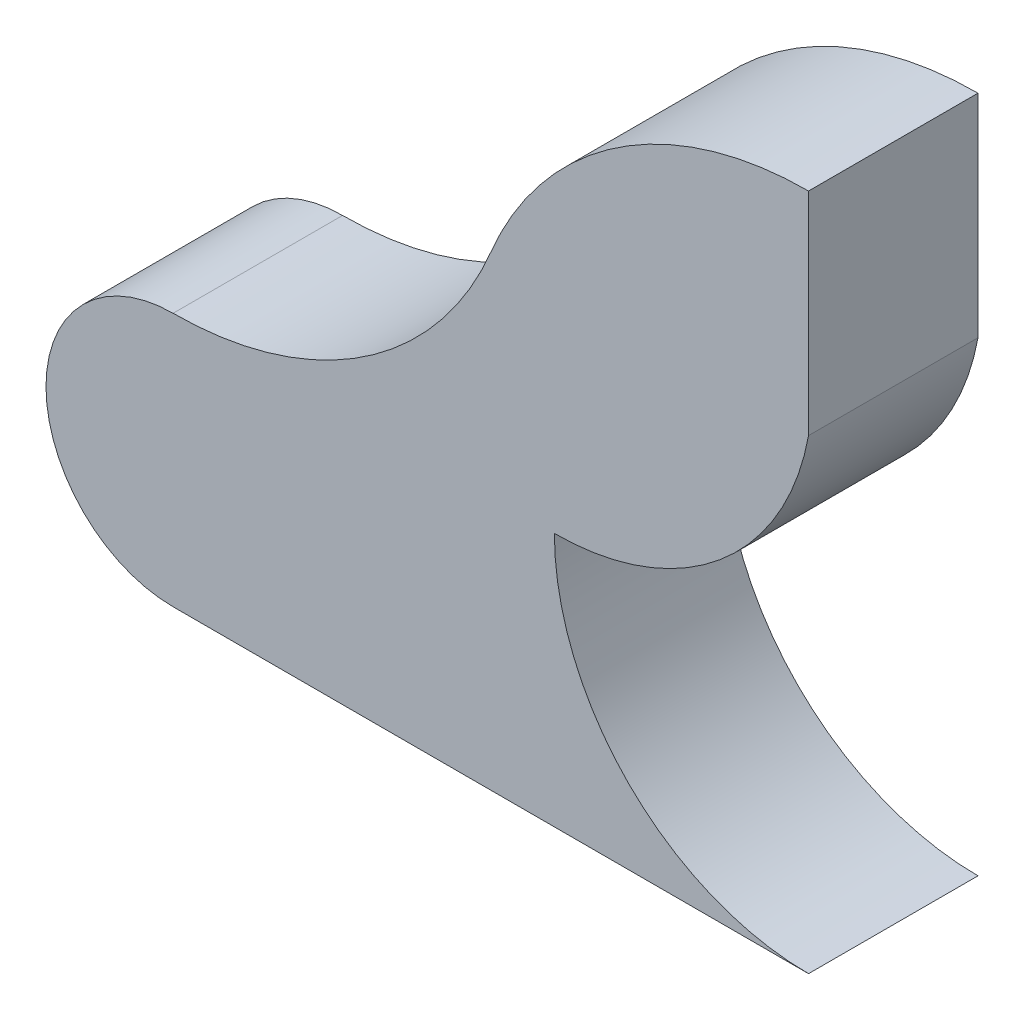
ISO-10303-21;
HEADER;
FILE_DESCRIPTION(('STEP AP214'),'2;1');
FILE_NAME('part.step','',(''),(''),'','','');
FILE_SCHEMA(('AUTOMOTIVE_DESIGN { 1 0 10303 214 1 1 1 1 }'));
ENDSEC;
DATA;
#1=APPLICATION_CONTEXT('core data for automotive mechanical design processes');
#2=APPLICATION_PROTOCOL_DEFINITION('international standard','automotive_design',2000,#1);
#3=PRODUCT_CONTEXT('',#1,'mechanical');
#4=PRODUCT('Part','Part','',(#3));
#5=PRODUCT_RELATED_PRODUCT_CATEGORY('part','',(#4));
#6=PRODUCT_DEFINITION_FORMATION('','',#4);
#7=PRODUCT_DEFINITION_CONTEXT('part definition',#1,'design');
#8=PRODUCT_DEFINITION('design','',#6,#7);
#9=PRODUCT_DEFINITION_SHAPE('','',#8);
#10=(LENGTH_UNIT() NAMED_UNIT(*) SI_UNIT(.MILLI.,.METRE.));
#11=(NAMED_UNIT(*) PLANE_ANGLE_UNIT() SI_UNIT($,.RADIAN.));
#12=(NAMED_UNIT(*) SI_UNIT($,.STERADIAN.) SOLID_ANGLE_UNIT());
#13=UNCERTAINTY_MEASURE_WITH_UNIT(LENGTH_MEASURE(1.E-05),#10,'distance_accuracy_value','');
#14=(GEOMETRIC_REPRESENTATION_CONTEXT(3) GLOBAL_UNCERTAINTY_ASSIGNED_CONTEXT((#13)) GLOBAL_UNIT_ASSIGNED_CONTEXT((#10,
#11,#12)) REPRESENTATION_CONTEXT('',''));
#15=CARTESIAN_POINT('',(0.,0.,0.));
#16=DIRECTION('',(0.,0.,1.));
#17=DIRECTION('',(1.,0.,0.));
#18=AXIS2_PLACEMENT_3D('',#15,#16,#17);
#19=CARTESIAN_POINT('',(-11.25,0.,-10.));
#20=DIRECTION('',(0.,0.,1.));
#21=DIRECTION('',(1.,0.,0.));
#22=AXIS2_PLACEMENT_3D('',#19,#20,#21);
#23=PLANE('',#22);
#24=DIRECTION('',(1.,0.,0.));
#25=VECTOR('',#24,1.);
#26=CARTESIAN_POINT('',(11.25,-7.5,-10.));
#27=LINE('',#26,#25);
#28=CARTESIAN_POINT('',(-11.25,-7.50000000000002,-10.));
#29=VERTEX_POINT('',#28);
#30=CARTESIAN_POINT('',(26.25,-7.5,-10.));
#31=VERTEX_POINT('',#30);
#32=EDGE_CURVE('E308',#29,#31,#27,.T.);
#33=ORIENTED_EDGE('',*,*,#32,.F.);
#34=CARTESIAN_POINT('',(-11.25,0.,-10.));
#35=DIRECTION('',(0.,0.,1.));
#36=DIRECTION('',(1.,0.,0.));
#37=AXIS2_PLACEMENT_3D('',#34,#35,#36);
#38=CIRCLE('',#37,7.50000000000001);
#39=CARTESIAN_POINT('',(-11.25,7.5,-10.));
#40=VERTEX_POINT('',#39);
#41=EDGE_CURVE('E305',#40,#29,#38,.T.);
#42=ORIENTED_EDGE('',*,*,#41,.F.);
#43=CARTESIAN_POINT('',(-11.25,27.8125,-10.));
#44=DIRECTION('',(0.,0.,1.));
#45=DIRECTION('',(1.,0.,0.));
#46=AXIS2_PLACEMENT_3D('',#43,#44,#45);
#47=CIRCLE('',#46,20.3125);
#48=CARTESIAN_POINT('',(7.5,20.,-10.));
#49=VERTEX_POINT('',#48);
#50=EDGE_CURVE('E230',#40,#49,#47,.T.);
#51=ORIENTED_EDGE('',*,*,#50,.T.);
#52=CARTESIAN_POINT('',(26.25,12.1875000000001,-10.));
#53=DIRECTION('',(0.,0.,-1.));
#54=DIRECTION('',(-1.,0.,0.));
#55=AXIS2_PLACEMENT_3D('',#52,#53,#54);
#56=CIRCLE('',#55,20.3124999999999);
#57=CARTESIAN_POINT('',(26.25,32.5,-10.));
#58=VERTEX_POINT('',#57);
#59=EDGE_CURVE('E246',#49,#58,#56,.T.);
#60=ORIENTED_EDGE('',*,*,#59,.T.);
#61=DIRECTION('',(0.,-1.,0.));
#62=VECTOR('',#61,1.);
#63=CARTESIAN_POINT('',(26.25,20.,-10.));
#64=LINE('',#63,#62);
#65=CARTESIAN_POINT('',(26.25,20.,-10.));
#66=VERTEX_POINT('',#65);
#67=EDGE_CURVE('E249',#58,#66,#64,.T.);
#68=ORIENTED_EDGE('',*,*,#67,.T.);
#69=CARTESIAN_POINT('',(11.25,22.75,-10.));
#70=DIRECTION('',(0.,0.,-1.));
#71=DIRECTION('',(1.,0.,0.));
#72=AXIS2_PLACEMENT_3D('',#69,#70,#71);
#73=CIRCLE('',#72,15.25);
#74=CARTESIAN_POINT('',(11.25,7.5,-10.));
#75=VERTEX_POINT('',#74);
#76=EDGE_CURVE('E235',#66,#75,#73,.T.);
#77=ORIENTED_EDGE('',*,*,#76,.T.);
#78=CARTESIAN_POINT('',(26.25,7.5,-10.));
#79=DIRECTION('',(0.,0.,-1.));
#80=DIRECTION('',(1.,0.,0.));
#81=AXIS2_PLACEMENT_3D('',#78,#79,#80);
#82=CIRCLE('',#81,15.);
#83=EDGE_CURVE('E311',#31,#75,#82,.T.);
#84=ORIENTED_EDGE('',*,*,#83,.F.);
#85=EDGE_LOOP('',(#33,#42,#51,#60,#68,#77,#84));
#86=FACE_BOUND('',#85,.T.);
#87=CARTESIAN_POINT('',(-11.25,0.,-10.));
#88=DIRECTION('',(0.,0.,1.));
#89=DIRECTION('',(1.,0.,0.));
#90=AXIS2_PLACEMENT_3D('',#87,#88,#89);
#91=CIRCLE('',#90,6.50000000000001);
#92=CARTESIAN_POINT('',(-11.25,6.5,-10.));
#93=VERTEX_POINT('',#92);
#94=CARTESIAN_POINT('',(-11.25,-6.49999999999999,-10.));
#95=VERTEX_POINT('',#94);
#96=EDGE_CURVE('E288',#93,#95,#91,.T.);
#97=ORIENTED_EDGE('',*,*,#96,.T.);
#98=DIRECTION('',(0.,-1.,0.));
#99=VECTOR('',#98,1.);
#100=CARTESIAN_POINT('',(-11.25,-6.50000000000002,-10.));
#101=LINE('',#100,#99);
#102=CARTESIAN_POINT('',(-11.25,-5.50000000000002,-10.));
#103=VERTEX_POINT('',#102);
#104=EDGE_CURVE('E264',#103,#95,#101,.T.);
#105=ORIENTED_EDGE('',*,*,#104,.F.);
#106=DIRECTION('',(-1.,0.,0.));
#107=VECTOR('',#106,1.);
#108=CARTESIAN_POINT('',(13.2596189432334,-5.50000000000002,-10.));
#109=LINE('',#108,#107);
#110=CARTESIAN_POINT('',(13.2596189432334,-5.50000000000002,-10.));
#111=VERTEX_POINT('',#110);
#112=EDGE_CURVE('E261',#111,#103,#109,.T.);
#113=ORIENTED_EDGE('',*,*,#112,.F.);
#114=DIRECTION('',(0.,1.,0.));
#115=VECTOR('',#114,1.);
#116=CARTESIAN_POINT('',(13.2596189432334,-7.50000000000001,-10.));
#117=LINE('',#116,#115);
#118=CARTESIAN_POINT('',(13.2596189432334,-6.49999999999999,-10.));
#119=VERTEX_POINT('',#118);
#120=EDGE_CURVE('E256',#119,#111,#117,.T.);
#121=ORIENTED_EDGE('',*,*,#120,.F.);
#122=DIRECTION('',(1.,0.,0.));
#123=VECTOR('',#122,1.);
#124=CARTESIAN_POINT('',(-11.25,-6.49999999999999,-10.));
#125=LINE('',#124,#123);
#126=CARTESIAN_POINT('',(18.5040333075852,-6.5,-10.));
#127=VERTEX_POINT('',#126);
#128=EDGE_CURVE('E298',#119,#127,#125,.T.);
#129=ORIENTED_EDGE('',*,*,#128,.T.);
#130=CARTESIAN_POINT('',(26.25,7.5,-10.));
#131=DIRECTION('',(0.,0.,1.));
#132=DIRECTION('',(1.,0.,0.));
#133=AXIS2_PLACEMENT_3D('',#130,#131,#132);
#134=CIRCLE('',#133,16.);
#135=CARTESIAN_POINT('',(10.2812805773287,6.5,-10.));
#136=VERTEX_POINT('',#135);
#137=EDGE_CURVE('E301',#127,#136,#134,.F.);
#138=ORIENTED_EDGE('',*,*,#137,.T.);
#139=DIRECTION('',(-1.,0.,0.));
#140=VECTOR('',#139,1.);
#141=CARTESIAN_POINT('',(-11.25,6.5,-10.));
#142=LINE('',#141,#140);
#143=EDGE_CURVE('E284',#136,#93,#142,.T.);
#144=ORIENTED_EDGE('',*,*,#143,.T.);
#145=EDGE_LOOP('',(#97,#105,#113,#121,#129,#138,#144));
#146=FACE_BOUND('',#145,.T.);
#147=DIRECTION('',(-1.,0.,0.));
#148=VECTOR('',#147,1.);
#149=CARTESIAN_POINT('',(-11.25,7.5,-10.));
#150=LINE('',#149,#148);
#151=CARTESIAN_POINT('',(10.25,7.5,-10.));
#152=VERTEX_POINT('',#151);
#153=CARTESIAN_POINT('',(-4.79825604971803,7.5,-10.));
#154=VERTEX_POINT('',#153);
#155=EDGE_CURVE('E186',#152,#154,#150,.T.);
#156=ORIENTED_EDGE('',*,*,#155,.F.);
#157=CARTESIAN_POINT('',(26.25,7.5,-10.));
#158=DIRECTION('',(0.,0.,1.));
#159=DIRECTION('',(1.,0.,0.));
#160=AXIS2_PLACEMENT_3D('',#157,#158,#159);
#161=CIRCLE('',#160,16.);
#162=CARTESIAN_POINT('',(10.283369893137,8.53282284570857,-10.));
#163=VERTEX_POINT('',#162);
#164=EDGE_CURVE('E185',#152,#163,#161,.F.);
#165=ORIENTED_EDGE('',*,*,#164,.T.);
#166=CARTESIAN_POINT('',(11.25,22.75,-10.));
#167=DIRECTION('',(0.,0.,1.));
#168=DIRECTION('',(1.,0.,0.));
#169=AXIS2_PLACEMENT_3D('',#166,#167,#168);
#170=CIRCLE('',#169,14.25);
#171=CARTESIAN_POINT('',(25.25,20.0924635468163,-10.));
#172=VERTEX_POINT('',#171);
#173=EDGE_CURVE('E200',#172,#163,#170,.F.);
#174=ORIENTED_EDGE('',*,*,#173,.F.);
#175=DIRECTION('',(0.,-1.,0.));
#176=VECTOR('',#175,1.);
#177=CARTESIAN_POINT('',(25.25,20.,-10.));
#178=LINE('',#177,#176);
#179=CARTESIAN_POINT('',(25.25,31.4740926552618,-10.));
#180=VERTEX_POINT('',#179);
#181=EDGE_CURVE('E54',#180,#172,#178,.T.);
#182=ORIENTED_EDGE('',*,*,#181,.F.);
#183=CARTESIAN_POINT('',(26.25,12.1875000000001,-10.));
#184=DIRECTION('',(0.,0.,1.));
#185=DIRECTION('',(1.,0.,0.));
#186=AXIS2_PLACEMENT_3D('',#183,#184,#185);
#187=CIRCLE('',#186,19.3124999999999);
#188=CARTESIAN_POINT('',(8.42307692307693,19.6153846153846,-10.));
#189=VERTEX_POINT('',#188);
#190=EDGE_CURVE('E220',#189,#180,#187,.F.);
#191=ORIENTED_EDGE('',*,*,#190,.F.);
#192=CARTESIAN_POINT('',(-11.25,27.8125,-10.));
#193=DIRECTION('',(0.,0.,1.));
#194=DIRECTION('',(1.,0.,0.));
#195=AXIS2_PLACEMENT_3D('',#192,#193,#194);
#196=CIRCLE('',#195,21.3125);
#197=EDGE_CURVE('E218',#154,#189,#196,.T.);
#198=ORIENTED_EDGE('',*,*,#197,.F.);
#199=EDGE_LOOP('',(#156,#165,#174,#182,#191,#198));
#200=FACE_BOUND('',#199,.T.);
#201=ADVANCED_FACE('F39',(#86,#146,#200),#23,.F.);
#202=CARTESIAN_POINT('',(-11.25,0.,-10.));
#203=DIRECTION('',(0.,0.,1.));
#204=DIRECTION('',(1.,0.,0.));
#205=AXIS2_PLACEMENT_3D('',#202,#203,#204);
#206=CYLINDRICAL_SURFACE('',#205,7.50000000000001);
#207=CARTESIAN_POINT('',(-11.25,0.,0.));
#208=DIRECTION('',(0.,0.,1.));
#209=DIRECTION('',(1.,0.,0.));
#210=AXIS2_PLACEMENT_3D('',#207,#208,#209);
#211=CIRCLE('',#210,7.50000000000001);
#212=CARTESIAN_POINT('',(-11.25,7.5,0.));
#213=VERTEX_POINT('',#212);
#214=CARTESIAN_POINT('',(-11.25,-7.50000000000002,0.));
#215=VERTEX_POINT('',#214);
#216=EDGE_CURVE('E279',#213,#215,#211,.T.);
#217=ORIENTED_EDGE('',*,*,#216,.F.);
#218=DIRECTION('',(0.,0.,1.));
#219=VECTOR('',#218,1.);
#220=CARTESIAN_POINT('',(-11.25,7.5,-10.));
#221=LINE('',#220,#219);
#222=EDGE_CURVE('E321',#40,#213,#221,.T.);
#223=ORIENTED_EDGE('',*,*,#222,.F.);
#224=ORIENTED_EDGE('',*,*,#41,.T.);
#225=DIRECTION('',(0.,0.,1.));
#226=VECTOR('',#225,1.);
#227=CARTESIAN_POINT('',(-11.25,-7.50000000000002,-10.));
#228=LINE('',#227,#226);
#229=EDGE_CURVE('E314',#29,#215,#228,.T.);
#230=ORIENTED_EDGE('',*,*,#229,.T.);
#231=EDGE_LOOP('',(#217,#223,#224,#230));
#232=FACE_BOUND('',#231,.T.);
#233=ADVANCED_FACE('F41',(#232),#206,.T.);
#234=CARTESIAN_POINT('',(26.25,7.5,-10.));
#235=DIRECTION('',(0.,0.,1.));
#236=DIRECTION('',(1.,0.,0.));
#237=AXIS2_PLACEMENT_3D('',#234,#235,#236);
#238=CYLINDRICAL_SURFACE('',#237,15.);
#239=CARTESIAN_POINT('',(26.25,7.5,0.));
#240=DIRECTION('',(0.,0.,-1.));
#241=DIRECTION('',(1.,0.,0.));
#242=AXIS2_PLACEMENT_3D('',#239,#240,#241);
#243=CIRCLE('',#242,15.);
#244=CARTESIAN_POINT('',(26.25,-7.5,0.));
#245=VERTEX_POINT('',#244);
#246=CARTESIAN_POINT('',(11.25,7.5,0.));
#247=VERTEX_POINT('',#246);
#248=EDGE_CURVE('E309',#245,#247,#243,.T.);
#249=ORIENTED_EDGE('',*,*,#248,.F.);
#250=DIRECTION('',(0.,0.,1.));
#251=VECTOR('',#250,1.);
#252=CARTESIAN_POINT('',(26.25,-7.5,-10.));
#253=LINE('',#252,#251);
#254=EDGE_CURVE('E328',#31,#245,#253,.T.);
#255=ORIENTED_EDGE('',*,*,#254,.F.);
#256=ORIENTED_EDGE('',*,*,#83,.T.);
#257=DIRECTION('',(0.,0.,1.));
#258=VECTOR('',#257,1.);
#259=CARTESIAN_POINT('',(11.25,7.5,-10.));
#260=LINE('',#259,#258);
#261=EDGE_CURVE('E325',#75,#247,#260,.T.);
#262=ORIENTED_EDGE('',*,*,#261,.T.);
#263=EDGE_LOOP('',(#249,#255,#256,#262));
#264=FACE_BOUND('',#263,.T.);
#265=ADVANCED_FACE('F386',(#264),#238,.F.);
#266=CARTESIAN_POINT('',(11.25,-7.5,-10.));
#267=DIRECTION('',(0.,-1.,0.));
#268=DIRECTION('',(1.,0.,0.));
#269=AXIS2_PLACEMENT_3D('',#266,#267,#268);
#270=PLANE('',#269);
#271=ORIENTED_EDGE('',*,*,#254,.T.);
#272=DIRECTION('',(1.,0.,0.));
#273=VECTOR('',#272,1.);
#274=CARTESIAN_POINT('',(11.25,-7.5,0.));
#275=LINE('',#274,#273);
#276=EDGE_CURVE('E317',#215,#245,#275,.T.);
#277=ORIENTED_EDGE('',*,*,#276,.F.);
#278=ORIENTED_EDGE('',*,*,#229,.F.);
#279=ORIENTED_EDGE('',*,*,#32,.T.);
#280=EDGE_LOOP('',(#271,#277,#278,#279));
#281=FACE_BOUND('',#280,.T.);
#282=ADVANCED_FACE('F394',(#281),#270,.T.);
#283=CARTESIAN_POINT('',(-11.25,0.,0.));
#284=DIRECTION('',(0.,0.,1.));
#285=DIRECTION('',(1.,0.,0.));
#286=AXIS2_PLACEMENT_3D('',#283,#284,#285);
#287=PLANE('',#286);
#288=ORIENTED_EDGE('',*,*,#216,.T.);
#289=ORIENTED_EDGE('',*,*,#276,.T.);
#290=ORIENTED_EDGE('',*,*,#248,.T.);
#291=CARTESIAN_POINT('',(11.25,22.75,0.));
#292=DIRECTION('',(0.,0.,-1.));
#293=DIRECTION('',(1.,0.,0.));
#294=AXIS2_PLACEMENT_3D('',#291,#292,#293);
#295=CIRCLE('',#294,15.25);
#296=CARTESIAN_POINT('',(26.25,20.,0.));
#297=VERTEX_POINT('',#296);
#298=EDGE_CURVE('E241',#297,#247,#295,.T.);
#299=ORIENTED_EDGE('',*,*,#298,.F.);
#300=DIRECTION('',(0.,-1.,0.));
#301=VECTOR('',#300,1.);
#302=CARTESIAN_POINT('',(26.25,20.,0.));
#303=LINE('',#302,#301);
#304=CARTESIAN_POINT('',(26.25,32.5,0.));
#305=VERTEX_POINT('',#304);
#306=EDGE_CURVE('E238',#305,#297,#303,.T.);
#307=ORIENTED_EDGE('',*,*,#306,.F.);
#308=CARTESIAN_POINT('',(26.25,12.1875000000001,0.));
#309=DIRECTION('',(0.,0.,-1.));
#310=DIRECTION('',(-1.,0.,0.));
#311=AXIS2_PLACEMENT_3D('',#308,#309,#310);
#312=CIRCLE('',#311,20.3124999999999);
#313=CARTESIAN_POINT('',(7.5,20.,0.));
#314=VERTEX_POINT('',#313);
#315=EDGE_CURVE('E234',#314,#305,#312,.T.);
#316=ORIENTED_EDGE('',*,*,#315,.F.);
#317=CARTESIAN_POINT('',(-11.25,27.8125,0.));
#318=DIRECTION('',(0.,0.,1.));
#319=DIRECTION('',(1.,0.,0.));
#320=AXIS2_PLACEMENT_3D('',#317,#318,#319);
#321=CIRCLE('',#320,20.3125);
#322=EDGE_CURVE('E231',#213,#314,#321,.T.);
#323=ORIENTED_EDGE('',*,*,#322,.F.);
#324=EDGE_LOOP('',(#288,#289,#290,#299,#307,#316,#323));
#325=FACE_BOUND('',#324,.T.);
#326=ADVANCED_FACE('F392',(#325),#287,.T.);
#327=CARTESIAN_POINT('',(-11.25,0.,-10.));
#328=DIRECTION('',(0.,0.,1.));
#329=DIRECTION('',(1.,0.,0.));
#330=AXIS2_PLACEMENT_3D('',#327,#328,#329);
#331=CYLINDRICAL_SURFACE('',#330,6.50000000000001);
#332=CARTESIAN_POINT('',(-11.25,0.,-0.999999999999999));
#333=DIRECTION('',(0.,0.,1.));
#334=DIRECTION('',(1.,0.,0.));
#335=AXIS2_PLACEMENT_3D('',#332,#333,#334);
#336=CIRCLE('',#335,6.50000000000001);
#337=CARTESIAN_POINT('',(-11.25,6.5,-0.999999999999999));
#338=VERTEX_POINT('',#337);
#339=CARTESIAN_POINT('',(-11.25,-6.50000000000002,-1.));
#340=VERTEX_POINT('',#339);
#341=EDGE_CURVE('E273',#338,#340,#336,.T.);
#342=ORIENTED_EDGE('',*,*,#341,.T.);
#343=DIRECTION('',(0.,0.,1.));
#344=VECTOR('',#343,1.);
#345=CARTESIAN_POINT('',(-11.25,-6.50000000000002,-10.));
#346=LINE('',#345,#344);
#347=EDGE_CURVE('E281',#95,#340,#346,.T.);
#348=ORIENTED_EDGE('',*,*,#347,.F.);
#349=ORIENTED_EDGE('',*,*,#96,.F.);
#350=DIRECTION('',(0.,0.,1.));
#351=VECTOR('',#350,1.);
#352=CARTESIAN_POINT('',(-11.25,6.5,-10.));
#353=LINE('',#352,#351);
#354=EDGE_CURVE('E277',#93,#338,#353,.T.);
#355=ORIENTED_EDGE('',*,*,#354,.T.);
#356=EDGE_LOOP('',(#342,#348,#349,#355));
#357=FACE_BOUND('',#356,.T.);
#358=ADVANCED_FACE('F352',(#357),#331,.F.);
#359=CARTESIAN_POINT('',(-11.25,6.5,-10.));
#360=DIRECTION('',(0.,1.,0.));
#361=DIRECTION('',(-1.,0.,0.));
#362=AXIS2_PLACEMENT_3D('',#359,#360,#361);
#363=PLANE('',#362);
#364=DIRECTION('',(-1.,0.,0.));
#365=VECTOR('',#364,1.);
#366=CARTESIAN_POINT('',(-11.25,6.5,-1.));
#367=LINE('',#366,#365);
#368=CARTESIAN_POINT('',(10.2812805773287,6.5,-1.));
#369=VERTEX_POINT('',#368);
#370=EDGE_CURVE('E285',#369,#338,#367,.T.);
#371=ORIENTED_EDGE('',*,*,#370,.T.);
#372=ORIENTED_EDGE('',*,*,#354,.F.);
#373=ORIENTED_EDGE('',*,*,#143,.F.);
#374=DIRECTION('',(0.,0.,1.));
#375=VECTOR('',#374,1.);
#376=CARTESIAN_POINT('',(10.2812805773287,6.5,-10.));
#377=LINE('',#376,#375);
#378=EDGE_CURVE('E280',#136,#369,#377,.T.);
#379=ORIENTED_EDGE('',*,*,#378,.T.);
#380=EDGE_LOOP('',(#371,#372,#373,#379));
#381=FACE_BOUND('',#380,.T.);
#382=ADVANCED_FACE('F356',(#381),#363,.F.);
#383=CARTESIAN_POINT('',(26.25,7.5,-10.));
#384=DIRECTION('',(0.,0.,1.));
#385=DIRECTION('',(1.,0.,0.));
#386=AXIS2_PLACEMENT_3D('',#383,#384,#385);
#387=CYLINDRICAL_SURFACE('',#386,16.);
#388=CARTESIAN_POINT('',(26.25,7.5,-0.999999999999999));
#389=DIRECTION('',(0.,0.,1.));
#390=DIRECTION('',(1.,0.,0.));
#391=AXIS2_PLACEMENT_3D('',#388,#389,#390);
#392=CIRCLE('',#391,16.);
#393=CARTESIAN_POINT('',(18.5040333075852,-6.5,-0.999999999999999));
#394=VERTEX_POINT('',#393);
#395=EDGE_CURVE('E289',#394,#369,#392,.F.);
#396=ORIENTED_EDGE('',*,*,#395,.T.);
#397=ORIENTED_EDGE('',*,*,#378,.F.);
#398=ORIENTED_EDGE('',*,*,#137,.F.);
#399=DIRECTION('',(0.,0.,1.));
#400=VECTOR('',#399,1.);
#401=CARTESIAN_POINT('',(18.5040333075852,-6.5,-10.));
#402=LINE('',#401,#400);
#403=EDGE_CURVE('E283',#127,#394,#402,.T.);
#404=ORIENTED_EDGE('',*,*,#403,.T.);
#405=EDGE_LOOP('',(#396,#397,#398,#404));
#406=FACE_BOUND('',#405,.T.);
#407=ADVANCED_FACE('F359',(#406),#387,.T.);
#408=CARTESIAN_POINT('',(11.25,-6.5,-10.));
#409=DIRECTION('',(0.,-1.,0.));
#410=DIRECTION('',(1.,0.,0.));
#411=AXIS2_PLACEMENT_3D('',#408,#409,#410);
#412=PLANE('',#411);
#413=ORIENTED_EDGE('',*,*,#128,.F.);
#414=DIRECTION('',(0.,0.,1.));
#415=VECTOR('',#414,1.);
#416=CARTESIAN_POINT('',(13.2596189432334,-6.5,-10.));
#417=LINE('',#416,#415);
#418=CARTESIAN_POINT('',(13.2596189432334,-6.50000000000002,-1.));
#419=VERTEX_POINT('',#418);
#420=EDGE_CURVE('E269',#119,#419,#417,.T.);
#421=ORIENTED_EDGE('',*,*,#420,.T.);
#422=DIRECTION('',(1.,0.,0.));
#423=VECTOR('',#422,1.);
#424=CARTESIAN_POINT('',(-11.25,-6.49999999999999,-1.));
#425=LINE('',#424,#423);
#426=EDGE_CURVE('E276',#419,#394,#425,.T.);
#427=ORIENTED_EDGE('',*,*,#426,.T.);
#428=ORIENTED_EDGE('',*,*,#403,.F.);
#429=EDGE_LOOP('',(#413,#421,#427,#428));
#430=FACE_BOUND('',#429,.T.);
#431=ADVANCED_FACE('F363',(#430),#412,.F.);
#432=CARTESIAN_POINT('',(-11.25,0.,-1.));
#433=DIRECTION('',(0.,0.,1.));
#434=DIRECTION('',(1.,0.,0.));
#435=AXIS2_PLACEMENT_3D('',#432,#433,#434);
#436=PLANE('',#435);
#437=DIRECTION('',(-1.,0.,0.));
#438=VECTOR('',#437,1.);
#439=CARTESIAN_POINT('',(-11.25,-5.50000000000002,-1.));
#440=LINE('',#439,#438);
#441=CARTESIAN_POINT('',(13.2596189432334,-5.50000000000002,-1.));
#442=VERTEX_POINT('',#441);
#443=CARTESIAN_POINT('',(-11.25,-5.50000000000002,-0.999999999999999));
#444=VERTEX_POINT('',#443);
#445=EDGE_CURVE('E47',#442,#444,#440,.T.);
#446=ORIENTED_EDGE('',*,*,#445,.T.);
#447=DIRECTION('',(0.,-1.,0.));
#448=VECTOR('',#447,1.);
#449=CARTESIAN_POINT('',(-11.25,0.,-1.));
#450=LINE('',#449,#448);
#451=EDGE_CURVE('E11',#444,#340,#450,.T.);
#452=ORIENTED_EDGE('',*,*,#451,.T.);
#453=ORIENTED_EDGE('',*,*,#341,.F.);
#454=ORIENTED_EDGE('',*,*,#370,.F.);
#455=ORIENTED_EDGE('',*,*,#395,.F.);
#456=ORIENTED_EDGE('',*,*,#426,.F.);
#457=DIRECTION('',(0.,1.,0.));
#458=VECTOR('',#457,1.);
#459=CARTESIAN_POINT('',(13.2596189432334,0.,-1.));
#460=LINE('',#459,#458);
#461=EDGE_CURVE('E324',#419,#442,#460,.T.);
#462=ORIENTED_EDGE('',*,*,#461,.T.);
#463=EDGE_LOOP('',(#446,#452,#453,#454,#455,#456,#462));
#464=FACE_BOUND('',#463,.T.);
#465=ADVANCED_FACE('F336',(#464),#436,.F.);
#466=CARTESIAN_POINT('',(-11.25,-6.50000000000002,-10.));
#467=DIRECTION('',(-1.,0.,0.));
#468=DIRECTION('',(0.,0.,1.));
#469=AXIS2_PLACEMENT_3D('',#466,#467,#468);
#470=PLANE('',#469);
#471=ORIENTED_EDGE('',*,*,#347,.T.);
#472=ORIENTED_EDGE('',*,*,#451,.F.);
#473=DIRECTION('',(0.,0.,1.));
#474=VECTOR('',#473,1.);
#475=CARTESIAN_POINT('',(-11.25,-5.50000000000002,-10.));
#476=LINE('',#475,#474);
#477=EDGE_CURVE('E266',#103,#444,#476,.T.);
#478=ORIENTED_EDGE('',*,*,#477,.F.);
#479=ORIENTED_EDGE('',*,*,#104,.T.);
#480=EDGE_LOOP('',(#471,#472,#478,#479));
#481=FACE_BOUND('',#480,.T.);
#482=ADVANCED_FACE('F344',(#481),#470,.T.);
#483=CARTESIAN_POINT('',(13.2596189432334,-5.50000000000002,-10.));
#484=DIRECTION('',(0.,1.,0.));
#485=DIRECTION('',(-1.,0.,0.));
#486=AXIS2_PLACEMENT_3D('',#483,#484,#485);
#487=PLANE('',#486);
#488=ORIENTED_EDGE('',*,*,#445,.F.);
#489=DIRECTION('',(0.,0.,1.));
#490=VECTOR('',#489,1.);
#491=CARTESIAN_POINT('',(13.2596189432334,-5.50000000000002,-10.));
#492=LINE('',#491,#490);
#493=EDGE_CURVE('E62',#111,#442,#492,.T.);
#494=ORIENTED_EDGE('',*,*,#493,.F.);
#495=ORIENTED_EDGE('',*,*,#112,.T.);
#496=ORIENTED_EDGE('',*,*,#477,.T.);
#497=EDGE_LOOP('',(#488,#494,#495,#496));
#498=FACE_BOUND('',#497,.T.);
#499=ADVANCED_FACE('F340',(#498),#487,.T.);
#500=CARTESIAN_POINT('',(13.2596189432334,-5.50000000000002,-10.));
#501=DIRECTION('',(1.,0.,0.));
#502=DIRECTION('',(0.,1.,0.));
#503=AXIS2_PLACEMENT_3D('',#500,#501,#502);
#504=PLANE('',#503);
#505=ORIENTED_EDGE('',*,*,#420,.F.);
#506=ORIENTED_EDGE('',*,*,#120,.T.);
#507=ORIENTED_EDGE('',*,*,#493,.T.);
#508=ORIENTED_EDGE('',*,*,#461,.F.);
#509=EDGE_LOOP('',(#505,#506,#507,#508));
#510=FACE_BOUND('',#509,.T.);
#511=ADVANCED_FACE('F364',(#510),#504,.T.);
#512=CARTESIAN_POINT('',(-11.25,27.8125,0.));
#513=DIRECTION('',(0.,0.,-1.));
#514=DIRECTION('',(-1.,0.,0.));
#515=AXIS2_PLACEMENT_3D('',#512,#513,#514);
#516=CYLINDRICAL_SURFACE('',#515,20.3125);
#517=ORIENTED_EDGE('',*,*,#50,.F.);
#518=ORIENTED_EDGE('',*,*,#222,.T.);
#519=ORIENTED_EDGE('',*,*,#322,.T.);
#520=DIRECTION('',(0.,0.,-1.));
#521=VECTOR('',#520,1.);
#522=CARTESIAN_POINT('',(7.5,20.,0.));
#523=LINE('',#522,#521);
#524=EDGE_CURVE('E243',#314,#49,#523,.T.);
#525=ORIENTED_EDGE('',*,*,#524,.T.);
#526=EDGE_LOOP('',(#517,#518,#519,#525));
#527=FACE_BOUND('',#526,.T.);
#528=ADVANCED_FACE('F366',(#527),#516,.F.);
#529=CARTESIAN_POINT('',(11.25,22.75,0.));
#530=DIRECTION('',(0.,0.,-1.));
#531=DIRECTION('',(-1.,0.,0.));
#532=AXIS2_PLACEMENT_3D('',#529,#530,#531);
#533=CYLINDRICAL_SURFACE('',#532,15.25);
#534=ORIENTED_EDGE('',*,*,#76,.F.);
#535=DIRECTION('',(0.,0.,-1.));
#536=VECTOR('',#535,1.);
#537=CARTESIAN_POINT('',(26.25,20.,0.));
#538=LINE('',#537,#536);
#539=EDGE_CURVE('E254',#297,#66,#538,.T.);
#540=ORIENTED_EDGE('',*,*,#539,.F.);
#541=ORIENTED_EDGE('',*,*,#298,.T.);
#542=ORIENTED_EDGE('',*,*,#261,.F.);
#543=EDGE_LOOP('',(#534,#540,#541,#542));
#544=FACE_BOUND('',#543,.T.);
#545=ADVANCED_FACE('F373',(#544),#533,.T.);
#546=CARTESIAN_POINT('',(26.25,20.,0.));
#547=DIRECTION('',(1.,0.,0.));
#548=DIRECTION('',(0.,1.,0.));
#549=AXIS2_PLACEMENT_3D('',#546,#547,#548);
#550=PLANE('',#549);
#551=ORIENTED_EDGE('',*,*,#67,.F.);
#552=DIRECTION('',(0.,0.,-1.));
#553=VECTOR('',#552,1.);
#554=CARTESIAN_POINT('',(26.25,32.5,0.));
#555=LINE('',#554,#553);
#556=EDGE_CURVE('E257',#305,#58,#555,.T.);
#557=ORIENTED_EDGE('',*,*,#556,.F.);
#558=ORIENTED_EDGE('',*,*,#306,.T.);
#559=ORIENTED_EDGE('',*,*,#539,.T.);
#560=EDGE_LOOP('',(#551,#557,#558,#559));
#561=FACE_BOUND('',#560,.T.);
#562=ADVANCED_FACE('F417',(#561),#550,.T.);
#563=CARTESIAN_POINT('',(26.25,12.1875000000001,0.));
#564=DIRECTION('',(0.,0.,-1.));
#565=DIRECTION('',(-1.,0.,0.));
#566=AXIS2_PLACEMENT_3D('',#563,#564,#565);
#567=CYLINDRICAL_SURFACE('',#566,20.3124999999999);
#568=ORIENTED_EDGE('',*,*,#59,.F.);
#569=ORIENTED_EDGE('',*,*,#524,.F.);
#570=ORIENTED_EDGE('',*,*,#315,.T.);
#571=ORIENTED_EDGE('',*,*,#556,.T.);
#572=EDGE_LOOP('',(#568,#569,#570,#571));
#573=FACE_BOUND('',#572,.T.);
#574=ADVANCED_FACE('F420',(#573),#567,.T.);
#575=CARTESIAN_POINT('',(26.25,7.5,-10.));
#576=DIRECTION('',(0.,0.,1.));
#577=DIRECTION('',(1.,0.,0.));
#578=AXIS2_PLACEMENT_3D('',#575,#576,#577);
#579=CYLINDRICAL_SURFACE('',#578,16.);
#580=CARTESIAN_POINT('',(26.25,7.5,-0.999999999999999));
#581=DIRECTION('',(0.,0.,1.));
#582=DIRECTION('',(1.,0.,0.));
#583=AXIS2_PLACEMENT_3D('',#580,#581,#582);
#584=CIRCLE('',#583,16.);
#585=CARTESIAN_POINT('',(10.25,7.5,-0.999999999999999));
#586=VERTEX_POINT('',#585);
#587=CARTESIAN_POINT('',(10.283369893137,8.53282284570857,-1.));
#588=VERTEX_POINT('',#587);
#589=EDGE_CURVE('E175',#586,#588,#584,.F.);
#590=ORIENTED_EDGE('',*,*,#589,.T.);
#591=DIRECTION('',(0.,0.,1.));
#592=VECTOR('',#591,1.);
#593=CARTESIAN_POINT('',(10.283369893137,8.53282284570857,-10.));
#594=LINE('',#593,#592);
#595=EDGE_CURVE('E180',#163,#588,#594,.T.);
#596=ORIENTED_EDGE('',*,*,#595,.F.);
#597=ORIENTED_EDGE('',*,*,#164,.F.);
#598=DIRECTION('',(0.,0.,1.));
#599=VECTOR('',#598,1.);
#600=CARTESIAN_POINT('',(10.25,7.5,-10.));
#601=LINE('',#600,#599);
#602=EDGE_CURVE('E182',#586,#152,#601,.F.);
#603=ORIENTED_EDGE('',*,*,#602,.F.);
#604=EDGE_LOOP('',(#590,#596,#597,#603));
#605=FACE_BOUND('',#604,.T.);
#606=ADVANCED_FACE('F177',(#605),#579,.T.);
#607=CARTESIAN_POINT('',(-11.25,0.,-1.));
#608=DIRECTION('',(0.,0.,1.));
#609=DIRECTION('',(1.,0.,0.));
#610=AXIS2_PLACEMENT_3D('',#607,#608,#609);
#611=PLANE('',#610);
#612=CARTESIAN_POINT('',(-11.25,27.8125,-1.));
#613=DIRECTION('',(0.,0.,1.));
#614=DIRECTION('',(1.,0.,0.));
#615=AXIS2_PLACEMENT_3D('',#612,#613,#614);
#616=CIRCLE('',#615,21.3125);
#617=CARTESIAN_POINT('',(-4.79825604971803,7.5,-1.));
#618=VERTEX_POINT('',#617);
#619=CARTESIAN_POINT('',(8.42307692307693,19.6153846153846,-1.));
#620=VERTEX_POINT('',#619);
#621=EDGE_CURVE('E210',#618,#620,#616,.T.);
#622=ORIENTED_EDGE('',*,*,#621,.T.);
#623=CARTESIAN_POINT('',(26.25,12.1875000000001,-1.));
#624=DIRECTION('',(0.,0.,1.));
#625=DIRECTION('',(1.,0.,0.));
#626=AXIS2_PLACEMENT_3D('',#623,#624,#625);
#627=CIRCLE('',#626,19.3124999999999);
#628=CARTESIAN_POINT('',(25.25,31.4740926552618,-1.));
#629=VERTEX_POINT('',#628);
#630=EDGE_CURVE('E208',#620,#629,#627,.F.);
#631=ORIENTED_EDGE('',*,*,#630,.T.);
#632=DIRECTION('',(0.,-1.,0.));
#633=VECTOR('',#632,1.);
#634=CARTESIAN_POINT('',(25.25,20.,-1.));
#635=LINE('',#634,#633);
#636=CARTESIAN_POINT('',(25.25,20.0924635468163,-1.));
#637=VERTEX_POINT('',#636);
#638=EDGE_CURVE('E194',#629,#637,#635,.T.);
#639=ORIENTED_EDGE('',*,*,#638,.T.);
#640=CARTESIAN_POINT('',(11.25,22.75,-1.));
#641=DIRECTION('',(0.,0.,1.));
#642=DIRECTION('',(1.,0.,0.));
#643=AXIS2_PLACEMENT_3D('',#640,#641,#642);
#644=CIRCLE('',#643,14.25);
#645=EDGE_CURVE('E190',#637,#588,#644,.F.);
#646=ORIENTED_EDGE('',*,*,#645,.T.);
#647=ORIENTED_EDGE('',*,*,#589,.F.);
#648=DIRECTION('',(1.,0.,0.));
#649=VECTOR('',#648,1.);
#650=CARTESIAN_POINT('',(-11.25,7.5,-0.999999999999999));
#651=LINE('',#650,#649);
#652=EDGE_CURVE('E228',#618,#586,#651,.T.);
#653=ORIENTED_EDGE('',*,*,#652,.F.);
#654=EDGE_LOOP('',(#622,#631,#639,#646,#647,#653));
#655=FACE_BOUND('',#654,.T.);
#656=ADVANCED_FACE('F191',(#655),#611,.F.);
#657=CARTESIAN_POINT('',(-11.25,7.5,-10.));
#658=DIRECTION('',(0.,1.,0.));
#659=DIRECTION('',(-1.,0.,0.));
#660=AXIS2_PLACEMENT_3D('',#657,#658,#659);
#661=PLANE('',#660);
#662=ORIENTED_EDGE('',*,*,#652,.T.);
#663=ORIENTED_EDGE('',*,*,#602,.T.);
#664=ORIENTED_EDGE('',*,*,#155,.T.);
#665=DIRECTION('',(0.,0.,-1.));
#666=VECTOR('',#665,1.);
#667=CARTESIAN_POINT('',(-4.79825604971803,7.5,0.));
#668=LINE('',#667,#666);
#669=EDGE_CURVE('E202',#618,#154,#668,.T.);
#670=ORIENTED_EDGE('',*,*,#669,.F.);
#671=EDGE_LOOP('',(#662,#663,#664,#670));
#672=FACE_BOUND('',#671,.T.);
#673=ADVANCED_FACE('F524',(#672),#661,.T.);
#674=CARTESIAN_POINT('',(-11.25,27.8125,0.));
#675=DIRECTION('',(0.,0.,-1.));
#676=DIRECTION('',(-1.,0.,0.));
#677=AXIS2_PLACEMENT_3D('',#674,#675,#676);
#678=CYLINDRICAL_SURFACE('',#677,21.3125);
#679=ORIENTED_EDGE('',*,*,#669,.T.);
#680=ORIENTED_EDGE('',*,*,#197,.T.);
#681=DIRECTION('',(0.,0.,-1.));
#682=VECTOR('',#681,1.);
#683=CARTESIAN_POINT('',(8.42307692307693,19.6153846153846,0.));
#684=LINE('',#683,#682);
#685=EDGE_CURVE('E196',#620,#189,#684,.T.);
#686=ORIENTED_EDGE('',*,*,#685,.F.);
#687=ORIENTED_EDGE('',*,*,#621,.F.);
#688=EDGE_LOOP('',(#679,#680,#686,#687));
#689=FACE_BOUND('',#688,.T.);
#690=ADVANCED_FACE('F534',(#689),#678,.T.);
#691=CARTESIAN_POINT('',(11.25,22.75,0.));
#692=DIRECTION('',(0.,0.,-1.));
#693=DIRECTION('',(-1.,0.,0.));
#694=AXIS2_PLACEMENT_3D('',#691,#692,#693);
#695=CYLINDRICAL_SURFACE('',#694,14.25);
#696=ORIENTED_EDGE('',*,*,#173,.T.);
#697=ORIENTED_EDGE('',*,*,#595,.T.);
#698=ORIENTED_EDGE('',*,*,#645,.F.);
#699=DIRECTION('',(0.,0.,-1.));
#700=VECTOR('',#699,1.);
#701=CARTESIAN_POINT('',(25.25,20.0924635468163,-1.));
#702=LINE('',#701,#700);
#703=EDGE_CURVE('E216',#637,#172,#702,.T.);
#704=ORIENTED_EDGE('',*,*,#703,.T.);
#705=EDGE_LOOP('',(#696,#697,#698,#704));
#706=FACE_BOUND('',#705,.T.);
#707=ADVANCED_FACE('F198',(#706),#695,.F.);
#708=CARTESIAN_POINT('',(25.25,20.,0.));
#709=DIRECTION('',(1.,0.,0.));
#710=DIRECTION('',(0.,1.,0.));
#711=AXIS2_PLACEMENT_3D('',#708,#709,#710);
#712=PLANE('',#711);
#713=ORIENTED_EDGE('',*,*,#181,.T.);
#714=ORIENTED_EDGE('',*,*,#703,.F.);
#715=ORIENTED_EDGE('',*,*,#638,.F.);
#716=DIRECTION('',(0.,0.,-1.));
#717=VECTOR('',#716,1.);
#718=CARTESIAN_POINT('',(25.25,31.4740926552618,-1.));
#719=LINE('',#718,#717);
#720=EDGE_CURVE('E214',#629,#180,#719,.T.);
#721=ORIENTED_EDGE('',*,*,#720,.T.);
#722=EDGE_LOOP('',(#713,#714,#715,#721));
#723=FACE_BOUND('',#722,.T.);
#724=ADVANCED_FACE('F552',(#723),#712,.F.);
#725=CARTESIAN_POINT('',(26.25,12.1875000000001,0.));
#726=DIRECTION('',(0.,0.,-1.));
#727=DIRECTION('',(-1.,0.,0.));
#728=AXIS2_PLACEMENT_3D('',#725,#726,#727);
#729=CYLINDRICAL_SURFACE('',#728,19.3124999999999);
#730=ORIENTED_EDGE('',*,*,#190,.T.);
#731=ORIENTED_EDGE('',*,*,#720,.F.);
#732=ORIENTED_EDGE('',*,*,#630,.F.);
#733=ORIENTED_EDGE('',*,*,#685,.T.);
#734=EDGE_LOOP('',(#730,#731,#732,#733));
#735=FACE_BOUND('',#734,.T.);
#736=ADVANCED_FACE('F560',(#735),#729,.F.);
#737=CLOSED_SHELL('',(#201,#233,#265,#282,#326,#358,#382,#407,#431,#465,#482,#499,#511,#528,
#545,#562,#574,#606,#656,#673,#690,#707,#724,#736));
#738=MANIFOLD_SOLID_BREP('B2',#737);
#739=ADVANCED_BREP_SHAPE_REPRESENTATION('',(#18,#738),#14);
#740=SHAPE_DEFINITION_REPRESENTATION(#9,#739);
ENDSEC;
END-ISO-10303-21;
